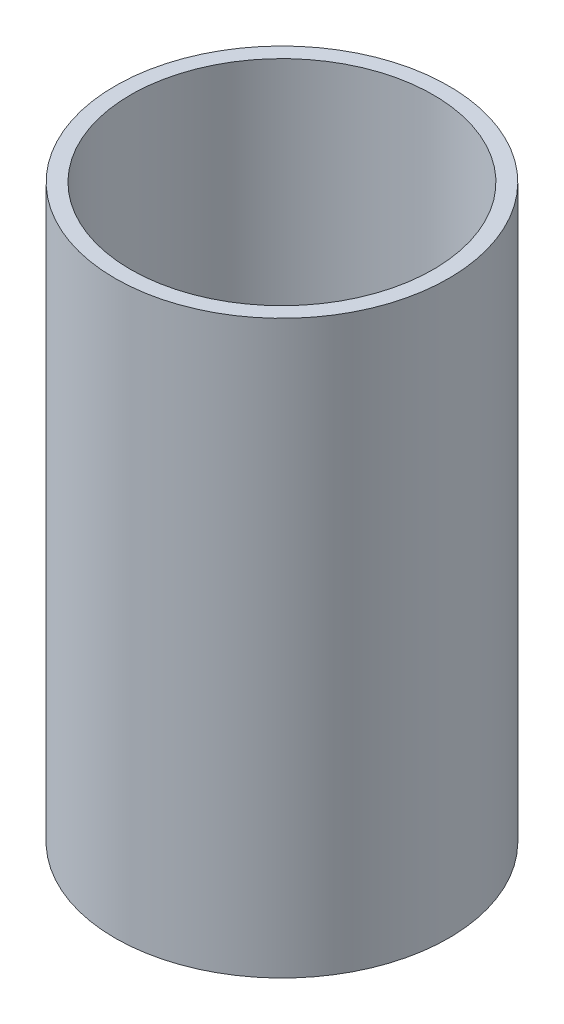
ISO-10303-21;
HEADER;
FILE_DESCRIPTION(('STEP AP214'),'2;1');
FILE_NAME('part.step','',(''),(''),'','','');
FILE_SCHEMA(('AUTOMOTIVE_DESIGN { 1 0 10303 214 1 1 1 1 }'));
ENDSEC;
DATA;
#1=APPLICATION_CONTEXT('core data for automotive mechanical design processes');
#2=APPLICATION_PROTOCOL_DEFINITION('international standard','automotive_design',2000,#1);
#3=PRODUCT_CONTEXT('',#1,'mechanical');
#4=PRODUCT('Part','Part','',(#3));
#5=PRODUCT_RELATED_PRODUCT_CATEGORY('part','',(#4));
#6=PRODUCT_DEFINITION_FORMATION('','',#4);
#7=PRODUCT_DEFINITION_CONTEXT('part definition',#1,'design');
#8=PRODUCT_DEFINITION('design','',#6,#7);
#9=PRODUCT_DEFINITION_SHAPE('','',#8);
#10=(LENGTH_UNIT() NAMED_UNIT(*) SI_UNIT(.MILLI.,.METRE.));
#11=(NAMED_UNIT(*) PLANE_ANGLE_UNIT() SI_UNIT($,.RADIAN.));
#12=(NAMED_UNIT(*) SI_UNIT($,.STERADIAN.) SOLID_ANGLE_UNIT());
#13=UNCERTAINTY_MEASURE_WITH_UNIT(LENGTH_MEASURE(1.E-05),#10,'distance_accuracy_value','');
#14=(GEOMETRIC_REPRESENTATION_CONTEXT(3) GLOBAL_UNCERTAINTY_ASSIGNED_CONTEXT((#13)) GLOBAL_UNIT_ASSIGNED_CONTEXT((#10,
#11,#12)) REPRESENTATION_CONTEXT('',''));
#15=CARTESIAN_POINT('',(0.,0.,0.));
#16=DIRECTION('',(0.,0.,1.));
#17=DIRECTION('',(1.,0.,0.));
#18=AXIS2_PLACEMENT_3D('',#15,#16,#17);
#19=CARTESIAN_POINT('',(0.,5.,0.));
#20=DIRECTION('',(0.,1.,0.));
#21=DIRECTION('',(0.,0.,1.));
#22=AXIS2_PLACEMENT_3D('',#19,#20,#21);
#23=PLANE('',#22);
#24=DIRECTION('',(0.,0.,1.));
#25=VECTOR('',#24,1.);
#26=CARTESIAN_POINT('',(5.34999999999999,5.,0.));
#27=LINE('',#26,#25);
#28=CARTESIAN_POINT('',(5.35,5.,-4.6));
#29=VERTEX_POINT('',#28);
#30=CARTESIAN_POINT('',(5.35,5.,-3.85));
#31=VERTEX_POINT('',#30);
#32=EDGE_CURVE('E242',#29,#31,#27,.T.);
#33=ORIENTED_EDGE('',*,*,#32,.F.);
#34=DIRECTION('',(1.,0.,0.));
#35=VECTOR('',#34,1.);
#36=CARTESIAN_POINT('',(0.,5.,-4.6));
#37=LINE('',#36,#35);
#38=CARTESIAN_POINT('',(-5.35,5.,-4.6));
#39=VERTEX_POINT('',#38);
#40=EDGE_CURVE('E327',#39,#29,#37,.T.);
#41=ORIENTED_EDGE('',*,*,#40,.F.);
#42=DIRECTION('',(0.,0.,1.));
#43=VECTOR('',#42,1.);
#44=CARTESIAN_POINT('',(-5.35,5.,0.));
#45=LINE('',#44,#43);
#46=CARTESIAN_POINT('',(-5.35,5.,-3.85));
#47=VERTEX_POINT('',#46);
#48=EDGE_CURVE('E11',#39,#47,#45,.T.);
#49=ORIENTED_EDGE('',*,*,#48,.T.);
#50=DIRECTION('',(1.,0.,0.));
#51=VECTOR('',#50,1.);
#52=CARTESIAN_POINT('',(0.,5.,-3.85));
#53=LINE('',#52,#51);
#54=EDGE_CURVE('E207',#47,#31,#53,.T.);
#55=ORIENTED_EDGE('',*,*,#54,.T.);
#56=EDGE_LOOP('',(#33,#41,#49,#55));
#57=FACE_BOUND('',#56,.T.);
#58=ADVANCED_FACE('F35',(#57),#23,.T.);
#59=CARTESIAN_POINT('',(0.,5.,-3.85));
#60=DIRECTION('',(0.,0.,-1.));
#61=DIRECTION('',(-1.,0.,0.));
#62=AXIS2_PLACEMENT_3D('',#59,#60,#61);
#63=PLANE('',#62);
#64=DIRECTION('',(1.,0.,0.));
#65=VECTOR('',#64,1.);
#66=CARTESIAN_POINT('',(0.,0.5,-3.85));
#67=LINE('',#66,#65);
#68=CARTESIAN_POINT('',(2.35,0.5,-3.85));
#69=VERTEX_POINT('',#68);
#70=CARTESIAN_POINT('',(6.6,0.5,-3.85));
#71=VERTEX_POINT('',#70);
#72=EDGE_CURVE('E273',#69,#71,#67,.T.);
#73=ORIENTED_EDGE('',*,*,#72,.T.);
#74=DIRECTION('',(0.,-1.,0.));
#75=VECTOR('',#74,1.);
#76=CARTESIAN_POINT('',(6.6,5.,-3.85));
#77=LINE('',#76,#75);
#78=CARTESIAN_POINT('',(6.6,20.,-3.85));
#79=VERTEX_POINT('',#78);
#80=EDGE_CURVE('E343',#79,#71,#77,.T.);
#81=ORIENTED_EDGE('',*,*,#80,.F.);
#82=DIRECTION('',(1.,0.,0.));
#83=VECTOR('',#82,1.);
#84=CARTESIAN_POINT('',(0.,20.,-3.85));
#85=LINE('',#84,#83);
#86=CARTESIAN_POINT('',(5.35,20.,-3.85));
#87=VERTEX_POINT('',#86);
#88=EDGE_CURVE('E224',#87,#79,#85,.T.);
#89=ORIENTED_EDGE('',*,*,#88,.F.);
#90=DIRECTION('',(0.,-1.,0.));
#91=VECTOR('',#90,1.);
#92=CARTESIAN_POINT('',(5.35,20.,-3.85));
#93=LINE('',#92,#91);
#94=EDGE_CURVE('E238',#87,#31,#93,.T.);
#95=ORIENTED_EDGE('',*,*,#94,.T.);
#96=ORIENTED_EDGE('',*,*,#54,.F.);
#97=DIRECTION('',(0.,-1.,0.));
#98=VECTOR('',#97,1.);
#99=CARTESIAN_POINT('',(-5.35,20.,-3.85));
#100=LINE('',#99,#98);
#101=CARTESIAN_POINT('',(-5.35,20.,-3.85));
#102=VERTEX_POINT('',#101);
#103=EDGE_CURVE('E50',#102,#47,#100,.T.);
#104=ORIENTED_EDGE('',*,*,#103,.F.);
#105=DIRECTION('',(1.,0.,0.));
#106=VECTOR('',#105,1.);
#107=CARTESIAN_POINT('',(0.,20.,-3.85));
#108=LINE('',#107,#106);
#109=CARTESIAN_POINT('',(-6.6,20.,-3.85));
#110=VERTEX_POINT('',#109);
#111=EDGE_CURVE('E262',#110,#102,#108,.T.);
#112=ORIENTED_EDGE('',*,*,#111,.F.);
#113=DIRECTION('',(0.,-1.,0.));
#114=VECTOR('',#113,1.);
#115=CARTESIAN_POINT('',(-6.6,5.,-3.85));
#116=LINE('',#115,#114);
#117=CARTESIAN_POINT('',(-6.6,0.5,-3.85));
#118=VERTEX_POINT('',#117);
#119=EDGE_CURVE('E346',#110,#118,#116,.T.);
#120=ORIENTED_EDGE('',*,*,#119,.T.);
#121=DIRECTION('',(1.,0.,0.));
#122=VECTOR('',#121,1.);
#123=CARTESIAN_POINT('',(0.,0.5,-3.85));
#124=LINE('',#123,#122);
#125=CARTESIAN_POINT('',(-2.35,0.5,-3.85));
#126=VERTEX_POINT('',#125);
#127=EDGE_CURVE('E283',#118,#126,#124,.T.);
#128=ORIENTED_EDGE('',*,*,#127,.T.);
#129=DIRECTION('',(0.,-1.,0.));
#130=VECTOR('',#129,1.);
#131=CARTESIAN_POINT('',(-2.35,0.5,-3.85));
#132=LINE('',#131,#130);
#133=CARTESIAN_POINT('',(-2.35,0.,-3.85));
#134=VERTEX_POINT('',#133);
#135=EDGE_CURVE('E293',#126,#134,#132,.T.);
#136=ORIENTED_EDGE('',*,*,#135,.T.);
#137=DIRECTION('',(1.,0.,0.));
#138=VECTOR('',#137,1.);
#139=CARTESIAN_POINT('',(0.,0.,-3.85));
#140=LINE('',#139,#138);
#141=CARTESIAN_POINT('',(2.35,0.,-3.85));
#142=VERTEX_POINT('',#141);
#143=EDGE_CURVE('E326',#134,#142,#140,.T.);
#144=ORIENTED_EDGE('',*,*,#143,.T.);
#145=DIRECTION('',(0.,-1.,0.));
#146=VECTOR('',#145,1.);
#147=CARTESIAN_POINT('',(2.35,0.5,-3.85));
#148=LINE('',#147,#146);
#149=EDGE_CURVE('E280',#69,#142,#148,.T.);
#150=ORIENTED_EDGE('',*,*,#149,.F.);
#151=EDGE_LOOP('',(#73,#81,#89,#95,#96,#104,#112,#120,#128,#136,#144,#150));
#152=FACE_BOUND('',#151,.T.);
#153=ADVANCED_FACE('F410',(#152),#63,.F.);
#154=CARTESIAN_POINT('',(0.,37.,0.));
#155=DIRECTION('',(0.,-1.,0.));
#156=DIRECTION('',(0.,0.,-1.));
#157=AXIS2_PLACEMENT_3D('',#154,#155,#156);
#158=CYLINDRICAL_SURFACE('',#157,9.8);
#159=CARTESIAN_POINT('',(0.,1.,0.));
#160=DIRECTION('',(0.,1.,0.));
#161=DIRECTION('',(0.,0.,1.));
#162=AXIS2_PLACEMENT_3D('',#159,#160,#161);
#163=CIRCLE('',#162,9.8);
#164=CARTESIAN_POINT('',(0.,1.,9.8));
#165=VERTEX_POINT('',#164);
#166=EDGE_CURVE('E43',#165,#165,#163,.T.);
#167=ORIENTED_EDGE('',*,*,#166,.F.);
#168=EDGE_LOOP('',(#167));
#169=FACE_BOUND('',#168,.T.);
#170=CARTESIAN_POINT('',(0.,37.,0.));
#171=DIRECTION('',(0.,1.,0.));
#172=DIRECTION('',(0.,0.,1.));
#173=AXIS2_PLACEMENT_3D('',#170,#171,#172);
#174=CIRCLE('',#173,9.8);
#175=CARTESIAN_POINT('',(0.,37.,9.8));
#176=VERTEX_POINT('',#175);
#177=EDGE_CURVE('E395',#176,#176,#174,.T.);
#178=ORIENTED_EDGE('',*,*,#177,.T.);
#179=EDGE_LOOP('',(#178));
#180=FACE_BOUND('',#179,.T.);
#181=ADVANCED_FACE('F37',(#169,#180),#158,.F.);
#182=CARTESIAN_POINT('',(0.,37.,0.));
#183=DIRECTION('',(0.,-1.,0.));
#184=DIRECTION('',(0.,0.,-1.));
#185=AXIS2_PLACEMENT_3D('',#182,#183,#184);
#186=CYLINDRICAL_SURFACE('',#185,10.8);
#187=CARTESIAN_POINT('',(0.,37.,0.));
#188=DIRECTION('',(0.,1.,0.));
#189=DIRECTION('',(0.,0.,1.));
#190=AXIS2_PLACEMENT_3D('',#187,#188,#189);
#191=CIRCLE('',#190,10.8);
#192=CARTESIAN_POINT('',(0.,37.,10.8));
#193=VERTEX_POINT('',#192);
#194=EDGE_CURVE('E398',#193,#193,#191,.T.);
#195=ORIENTED_EDGE('',*,*,#194,.F.);
#196=EDGE_LOOP('',(#195));
#197=FACE_BOUND('',#196,.T.);
#198=CARTESIAN_POINT('',(0.,0.,0.));
#199=DIRECTION('',(0.,1.,0.));
#200=DIRECTION('',(0.,0.,1.));
#201=AXIS2_PLACEMENT_3D('',#198,#199,#200);
#202=CIRCLE('',#201,10.8);
#203=CARTESIAN_POINT('',(0.,0.,10.8));
#204=VERTEX_POINT('',#203);
#205=EDGE_CURVE('E394',#204,#204,#202,.T.);
#206=ORIENTED_EDGE('',*,*,#205,.T.);
#207=EDGE_LOOP('',(#206));
#208=FACE_BOUND('',#207,.T.);
#209=ADVANCED_FACE('F409',(#197,#208),#186,.T.);
#210=CARTESIAN_POINT('',(0.,37.,0.));
#211=DIRECTION('',(0.,1.,0.));
#212=DIRECTION('',(0.,0.,1.));
#213=AXIS2_PLACEMENT_3D('',#210,#211,#212);
#214=PLANE('',#213);
#215=ORIENTED_EDGE('',*,*,#177,.F.);
#216=EDGE_LOOP('',(#215));
#217=FACE_BOUND('',#216,.T.);
#218=ORIENTED_EDGE('',*,*,#194,.T.);
#219=EDGE_LOOP('',(#218));
#220=FACE_BOUND('',#219,.T.);
#221=ADVANCED_FACE('F413',(#217,#220),#214,.T.);
#222=CARTESIAN_POINT('',(0.,0.,0.));
#223=DIRECTION('',(0.,1.,0.));
#224=DIRECTION('',(0.,0.,1.));
#225=AXIS2_PLACEMENT_3D('',#222,#223,#224);
#226=PLANE('',#225);
#227=ORIENTED_EDGE('',*,*,#143,.F.);
#228=DIRECTION('',(0.,0.,1.));
#229=VECTOR('',#228,1.);
#230=CARTESIAN_POINT('',(-2.35,0.,0.));
#231=LINE('',#230,#229);
#232=CARTESIAN_POINT('',(-2.35,0.,1.25));
#233=VERTEX_POINT('',#232);
#234=EDGE_CURVE('E367',#134,#233,#231,.T.);
#235=ORIENTED_EDGE('',*,*,#234,.T.);
#236=DIRECTION('',(1.,0.,0.));
#237=VECTOR('',#236,1.);
#238=CARTESIAN_POINT('',(0.,0.,1.25));
#239=LINE('',#238,#237);
#240=CARTESIAN_POINT('',(2.35,0.,1.25));
#241=VERTEX_POINT('',#240);
#242=EDGE_CURVE('E386',#233,#241,#239,.T.);
#243=ORIENTED_EDGE('',*,*,#242,.T.);
#244=DIRECTION('',(0.,0.,-1.));
#245=VECTOR('',#244,1.);
#246=CARTESIAN_POINT('',(2.35,0.,0.));
#247=LINE('',#246,#245);
#248=EDGE_CURVE('E364',#241,#142,#247,.T.);
#249=ORIENTED_EDGE('',*,*,#248,.T.);
#250=EDGE_LOOP('',(#227,#235,#243,#249));
#251=FACE_BOUND('',#250,.T.);
#252=ORIENTED_EDGE('',*,*,#205,.F.);
#253=EDGE_LOOP('',(#252));
#254=FACE_BOUND('',#253,.T.);
#255=ADVANCED_FACE('F416',(#251,#254),#226,.F.);
#256=CARTESIAN_POINT('',(2.35,1.,0.));
#257=DIRECTION('',(-1.,0.,0.));
#258=DIRECTION('',(0.,0.,1.));
#259=AXIS2_PLACEMENT_3D('',#256,#257,#258);
#260=PLANE('',#259);
#261=ORIENTED_EDGE('',*,*,#248,.F.);
#262=DIRECTION('',(0.,-1.,0.));
#263=VECTOR('',#262,1.);
#264=CARTESIAN_POINT('',(2.35,1.,1.25));
#265=LINE('',#264,#263);
#266=CARTESIAN_POINT('',(2.35,1.,1.25));
#267=VERTEX_POINT('',#266);
#268=EDGE_CURVE('E392',#267,#241,#265,.T.);
#269=ORIENTED_EDGE('',*,*,#268,.F.);
#270=DIRECTION('',(0.,0.,-1.));
#271=VECTOR('',#270,1.);
#272=CARTESIAN_POINT('',(2.35,1.,0.));
#273=LINE('',#272,#271);
#274=CARTESIAN_POINT('',(2.35,1.,-0.5));
#275=VERTEX_POINT('',#274);
#276=EDGE_CURVE('E371',#267,#275,#273,.T.);
#277=ORIENTED_EDGE('',*,*,#276,.T.);
#278=DIRECTION('',(0.,-1.,0.));
#279=VECTOR('',#278,1.);
#280=CARTESIAN_POINT('',(2.35,2.,-0.5));
#281=LINE('',#280,#279);
#282=CARTESIAN_POINT('',(2.35,2.,-0.5));
#283=VERTEX_POINT('',#282);
#284=EDGE_CURVE('E306',#283,#275,#281,.T.);
#285=ORIENTED_EDGE('',*,*,#284,.F.);
#286=DIRECTION('',(0.,0.,1.));
#287=VECTOR('',#286,1.);
#288=CARTESIAN_POINT('',(2.35,2.,0.));
#289=LINE('',#288,#287);
#290=CARTESIAN_POINT('',(2.35,2.,-1.25));
#291=VERTEX_POINT('',#290);
#292=EDGE_CURVE('E298',#291,#283,#289,.T.);
#293=ORIENTED_EDGE('',*,*,#292,.F.);
#294=DIRECTION('',(0.,-1.,0.));
#295=VECTOR('',#294,1.);
#296=CARTESIAN_POINT('',(2.35,2.,-1.25));
#297=LINE('',#296,#295);
#298=CARTESIAN_POINT('',(2.35,0.5,-1.25));
#299=VERTEX_POINT('',#298);
#300=EDGE_CURVE('E309',#291,#299,#297,.T.);
#301=ORIENTED_EDGE('',*,*,#300,.T.);
#302=DIRECTION('',(0.,0.,-1.));
#303=VECTOR('',#302,1.);
#304=CARTESIAN_POINT('',(2.35,0.5,0.));
#305=LINE('',#304,#303);
#306=EDGE_CURVE('E275',#299,#69,#305,.T.);
#307=ORIENTED_EDGE('',*,*,#306,.T.);
#308=ORIENTED_EDGE('',*,*,#149,.T.);
#309=EDGE_LOOP('',(#261,#269,#277,#285,#293,#301,#307,#308));
#310=FACE_BOUND('',#309,.T.);
#311=ADVANCED_FACE('F425',(#310),#260,.T.);
#312=CARTESIAN_POINT('',(0.,1.,1.25));
#313=DIRECTION('',(0.,0.,-1.));
#314=DIRECTION('',(-1.,0.,0.));
#315=AXIS2_PLACEMENT_3D('',#312,#313,#314);
#316=PLANE('',#315);
#317=ORIENTED_EDGE('',*,*,#242,.F.);
#318=DIRECTION('',(0.,-1.,0.));
#319=VECTOR('',#318,1.);
#320=CARTESIAN_POINT('',(-2.35,1.,1.25));
#321=LINE('',#320,#319);
#322=CARTESIAN_POINT('',(-2.35,1.,1.25));
#323=VERTEX_POINT('',#322);
#324=EDGE_CURVE('E384',#323,#233,#321,.T.);
#325=ORIENTED_EDGE('',*,*,#324,.F.);
#326=DIRECTION('',(1.,0.,0.));
#327=VECTOR('',#326,1.);
#328=CARTESIAN_POINT('',(0.,1.,1.25));
#329=LINE('',#328,#327);
#330=EDGE_CURVE('E374',#323,#267,#329,.T.);
#331=ORIENTED_EDGE('',*,*,#330,.T.);
#332=ORIENTED_EDGE('',*,*,#268,.T.);
#333=EDGE_LOOP('',(#317,#325,#331,#332));
#334=FACE_BOUND('',#333,.T.);
#335=ADVANCED_FACE('F431',(#334),#316,.T.);
#336=CARTESIAN_POINT('',(-2.35,1.,0.));
#337=DIRECTION('',(1.,0.,0.));
#338=DIRECTION('',(0.,0.,-1.));
#339=AXIS2_PLACEMENT_3D('',#336,#337,#338);
#340=PLANE('',#339);
#341=ORIENTED_EDGE('',*,*,#234,.F.);
#342=ORIENTED_EDGE('',*,*,#135,.F.);
#343=DIRECTION('',(0.,0.,-1.));
#344=VECTOR('',#343,1.);
#345=CARTESIAN_POINT('',(-2.35,0.5,0.));
#346=LINE('',#345,#344);
#347=CARTESIAN_POINT('',(-2.35,0.5,-1.25));
#348=VERTEX_POINT('',#347);
#349=EDGE_CURVE('E290',#348,#126,#346,.T.);
#350=ORIENTED_EDGE('',*,*,#349,.F.);
#351=DIRECTION('',(0.,-1.,0.));
#352=VECTOR('',#351,1.);
#353=CARTESIAN_POINT('',(-2.35,2.,-1.25));
#354=LINE('',#353,#352);
#355=CARTESIAN_POINT('',(-2.35,2.,-1.25));
#356=VERTEX_POINT('',#355);
#357=EDGE_CURVE('E57',#356,#348,#354,.T.);
#358=ORIENTED_EDGE('',*,*,#357,.F.);
#359=DIRECTION('',(0.,0.,1.));
#360=VECTOR('',#359,1.);
#361=CARTESIAN_POINT('',(-2.35,2.,0.));
#362=LINE('',#361,#360);
#363=CARTESIAN_POINT('',(-2.35,2.,-0.5));
#364=VERTEX_POINT('',#363);
#365=EDGE_CURVE('E317',#356,#364,#362,.T.);
#366=ORIENTED_EDGE('',*,*,#365,.T.);
#367=DIRECTION('',(0.,-1.,0.));
#368=VECTOR('',#367,1.);
#369=CARTESIAN_POINT('',(-2.35,2.,-0.5));
#370=LINE('',#369,#368);
#371=CARTESIAN_POINT('',(-2.35,1.,-0.5));
#372=VERTEX_POINT('',#371);
#373=EDGE_CURVE('E323',#364,#372,#370,.T.);
#374=ORIENTED_EDGE('',*,*,#373,.T.);
#375=DIRECTION('',(0.,0.,1.));
#376=VECTOR('',#375,1.);
#377=CARTESIAN_POINT('',(-2.35,1.,0.));
#378=LINE('',#377,#376);
#379=EDGE_CURVE('E377',#372,#323,#378,.T.);
#380=ORIENTED_EDGE('',*,*,#379,.T.);
#381=ORIENTED_EDGE('',*,*,#324,.T.);
#382=EDGE_LOOP('',(#341,#342,#350,#358,#366,#374,#380,#381));
#383=FACE_BOUND('',#382,.T.);
#384=ADVANCED_FACE('F489',(#383),#340,.T.);
#385=CARTESIAN_POINT('',(0.,1.,0.));
#386=DIRECTION('',(0.,1.,0.));
#387=DIRECTION('',(0.,0.,1.));
#388=AXIS2_PLACEMENT_3D('',#385,#386,#387);
#389=PLANE('',#388);
#390=DIRECTION('',(1.,0.,0.));
#391=VECTOR('',#390,1.);
#392=CARTESIAN_POINT('',(0.,1.,-4.6));
#393=LINE('',#392,#391);
#394=CARTESIAN_POINT('',(-7.35,1.,-4.6));
#395=VERTEX_POINT('',#394);
#396=CARTESIAN_POINT('',(7.35,1.,-4.6));
#397=VERTEX_POINT('',#396);
#398=EDGE_CURVE('E365',#395,#397,#393,.T.);
#399=ORIENTED_EDGE('',*,*,#398,.T.);
#400=DIRECTION('',(0.,0.,1.));
#401=VECTOR('',#400,1.);
#402=CARTESIAN_POINT('',(7.35,1.,0.));
#403=LINE('',#402,#401);
#404=CARTESIAN_POINT('',(7.35,1.,-0.500000000000001));
#405=VERTEX_POINT('',#404);
#406=EDGE_CURVE('E203',#397,#405,#403,.T.);
#407=ORIENTED_EDGE('',*,*,#406,.T.);
#408=DIRECTION('',(-1.,0.,0.));
#409=VECTOR('',#408,1.);
#410=CARTESIAN_POINT('',(0.,1.,-0.5));
#411=LINE('',#410,#409);
#412=EDGE_CURVE('E369',#405,#275,#411,.T.);
#413=ORIENTED_EDGE('',*,*,#412,.T.);
#414=ORIENTED_EDGE('',*,*,#276,.F.);
#415=ORIENTED_EDGE('',*,*,#330,.F.);
#416=ORIENTED_EDGE('',*,*,#379,.F.);
#417=DIRECTION('',(1.,0.,0.));
#418=VECTOR('',#417,1.);
#419=CARTESIAN_POINT('',(0.,1.,-0.5));
#420=LINE('',#419,#418);
#421=CARTESIAN_POINT('',(-7.35,1.,-0.5));
#422=VERTEX_POINT('',#421);
#423=EDGE_CURVE('E380',#422,#372,#420,.T.);
#424=ORIENTED_EDGE('',*,*,#423,.F.);
#425=DIRECTION('',(0.,0.,1.));
#426=VECTOR('',#425,1.);
#427=CARTESIAN_POINT('',(-7.35,1.,0.));
#428=LINE('',#427,#426);
#429=EDGE_CURVE('E382',#395,#422,#428,.T.);
#430=ORIENTED_EDGE('',*,*,#429,.F.);
#431=EDGE_LOOP('',(#399,#407,#413,#414,#415,#416,#424,#430));
#432=FACE_BOUND('',#431,.T.);
#433=ORIENTED_EDGE('',*,*,#166,.T.);
#434=EDGE_LOOP('',(#433));
#435=FACE_BOUND('',#434,.T.);
#436=ADVANCED_FACE('F405',(#432,#435),#389,.T.);
#437=CARTESIAN_POINT('',(0.,5.,-4.6));
#438=DIRECTION('',(0.,0.,-1.));
#439=DIRECTION('',(-1.,0.,0.));
#440=AXIS2_PLACEMENT_3D('',#437,#438,#439);
#441=PLANE('',#440);
#442=ORIENTED_EDGE('',*,*,#40,.T.);
#443=DIRECTION('',(0.,-1.,0.));
#444=VECTOR('',#443,1.);
#445=CARTESIAN_POINT('',(5.35,20.,-4.6));
#446=LINE('',#445,#444);
#447=CARTESIAN_POINT('',(5.35,20.,-4.6));
#448=VERTEX_POINT('',#447);
#449=EDGE_CURVE('E221',#448,#29,#446,.T.);
#450=ORIENTED_EDGE('',*,*,#449,.F.);
#451=DIRECTION('',(1.,0.,0.));
#452=VECTOR('',#451,1.);
#453=CARTESIAN_POINT('',(0.,20.,-4.6));
#454=LINE('',#453,#452);
#455=CARTESIAN_POINT('',(7.35,20.,-4.6));
#456=VERTEX_POINT('',#455);
#457=EDGE_CURVE('E213',#448,#456,#454,.T.);
#458=ORIENTED_EDGE('',*,*,#457,.T.);
#459=DIRECTION('',(0.,-1.,0.));
#460=VECTOR('',#459,1.);
#461=CARTESIAN_POINT('',(7.35,5.,-4.6));
#462=LINE('',#461,#460);
#463=EDGE_CURVE('E197',#456,#397,#462,.T.);
#464=ORIENTED_EDGE('',*,*,#463,.T.);
#465=ORIENTED_EDGE('',*,*,#398,.F.);
#466=DIRECTION('',(0.,-1.,0.));
#467=VECTOR('',#466,1.);
#468=CARTESIAN_POINT('',(-7.35,5.,-4.6));
#469=LINE('',#468,#467);
#470=CARTESIAN_POINT('',(-7.35,20.,-4.6));
#471=VERTEX_POINT('',#470);
#472=EDGE_CURVE('E361',#471,#395,#469,.T.);
#473=ORIENTED_EDGE('',*,*,#472,.F.);
#474=DIRECTION('',(1.,0.,0.));
#475=VECTOR('',#474,1.);
#476=CARTESIAN_POINT('',(0.,20.,-4.6));
#477=LINE('',#476,#475);
#478=CARTESIAN_POINT('',(-5.35,20.,-4.6));
#479=VERTEX_POINT('',#478);
#480=EDGE_CURVE('E244',#471,#479,#477,.T.);
#481=ORIENTED_EDGE('',*,*,#480,.T.);
#482=DIRECTION('',(0.,-1.,0.));
#483=VECTOR('',#482,1.);
#484=CARTESIAN_POINT('',(-5.35,20.,-4.6));
#485=LINE('',#484,#483);
#486=EDGE_CURVE('E266',#479,#39,#485,.T.);
#487=ORIENTED_EDGE('',*,*,#486,.T.);
#488=EDGE_LOOP('',(#442,#450,#458,#464,#465,#473,#481,#487));
#489=FACE_BOUND('',#488,.T.);
#490=ADVANCED_FACE('F220',(#489),#441,.T.);
#491=CARTESIAN_POINT('',(-7.35,5.,0.));
#492=DIRECTION('',(1.,0.,0.));
#493=DIRECTION('',(0.,0.,-1.));
#494=AXIS2_PLACEMENT_3D('',#491,#492,#493);
#495=PLANE('',#494);
#496=ORIENTED_EDGE('',*,*,#429,.T.);
#497=DIRECTION('',(0.,-1.,0.));
#498=VECTOR('',#497,1.);
#499=CARTESIAN_POINT('',(-7.35,5.,-0.5));
#500=LINE('',#499,#498);
#501=CARTESIAN_POINT('',(-7.35,20.,-0.5));
#502=VERTEX_POINT('',#501);
#503=EDGE_CURVE('E358',#502,#422,#500,.T.);
#504=ORIENTED_EDGE('',*,*,#503,.F.);
#505=DIRECTION('',(0.,0.,1.));
#506=VECTOR('',#505,1.);
#507=CARTESIAN_POINT('',(-7.35,20.,0.));
#508=LINE('',#507,#506);
#509=EDGE_CURVE('E247',#471,#502,#508,.T.);
#510=ORIENTED_EDGE('',*,*,#509,.F.);
#511=ORIENTED_EDGE('',*,*,#472,.T.);
#512=EDGE_LOOP('',(#496,#504,#510,#511));
#513=FACE_BOUND('',#512,.T.);
#514=ADVANCED_FACE('F480',(#513),#495,.F.);
#515=CARTESIAN_POINT('',(0.,5.,-0.5));
#516=DIRECTION('',(0.,0.,-1.));
#517=DIRECTION('',(-1.,0.,0.));
#518=AXIS2_PLACEMENT_3D('',#515,#516,#517);
#519=PLANE('',#518);
#520=DIRECTION('',(1.,0.,0.));
#521=VECTOR('',#520,1.);
#522=CARTESIAN_POINT('',(0.,2.,-0.5));
#523=LINE('',#522,#521);
#524=CARTESIAN_POINT('',(-5.35,2.,-0.5));
#525=VERTEX_POINT('',#524);
#526=EDGE_CURVE('E315',#525,#364,#523,.T.);
#527=ORIENTED_EDGE('',*,*,#526,.F.);
#528=DIRECTION('',(0.,-1.,0.));
#529=VECTOR('',#528,1.);
#530=CARTESIAN_POINT('',(-5.35,5.,-0.5));
#531=LINE('',#530,#529);
#532=CARTESIAN_POINT('',(-5.35,20.,-0.5));
#533=VERTEX_POINT('',#532);
#534=EDGE_CURVE('E355',#533,#525,#531,.T.);
#535=ORIENTED_EDGE('',*,*,#534,.F.);
#536=DIRECTION('',(1.,0.,0.));
#537=VECTOR('',#536,1.);
#538=CARTESIAN_POINT('',(0.,20.,-0.5));
#539=LINE('',#538,#537);
#540=EDGE_CURVE('E250',#502,#533,#539,.T.);
#541=ORIENTED_EDGE('',*,*,#540,.F.);
#542=ORIENTED_EDGE('',*,*,#503,.T.);
#543=ORIENTED_EDGE('',*,*,#423,.T.);
#544=ORIENTED_EDGE('',*,*,#373,.F.);
#545=EDGE_LOOP('',(#527,#535,#541,#542,#543,#544));
#546=FACE_BOUND('',#545,.T.);
#547=ADVANCED_FACE('F476',(#546),#519,.F.);
#548=CARTESIAN_POINT('',(-5.35,5.,0.));
#549=DIRECTION('',(1.,0.,0.));
#550=DIRECTION('',(0.,0.,-1.));
#551=AXIS2_PLACEMENT_3D('',#548,#549,#550);
#552=PLANE('',#551);
#553=DIRECTION('',(0.,0.,1.));
#554=VECTOR('',#553,1.);
#555=CARTESIAN_POINT('',(-5.35,2.,0.));
#556=LINE('',#555,#554);
#557=CARTESIAN_POINT('',(-5.35,2.,-1.25));
#558=VERTEX_POINT('',#557);
#559=EDGE_CURVE('E312',#558,#525,#556,.T.);
#560=ORIENTED_EDGE('',*,*,#559,.F.);
#561=DIRECTION('',(0.,-1.,0.));
#562=VECTOR('',#561,1.);
#563=CARTESIAN_POINT('',(-5.35,5.,-1.25));
#564=LINE('',#563,#562);
#565=CARTESIAN_POINT('',(-5.35,20.,-1.25));
#566=VERTEX_POINT('',#565);
#567=EDGE_CURVE('E352',#566,#558,#564,.T.);
#568=ORIENTED_EDGE('',*,*,#567,.F.);
#569=DIRECTION('',(0.,0.,1.));
#570=VECTOR('',#569,1.);
#571=CARTESIAN_POINT('',(-5.35,20.,0.));
#572=LINE('',#571,#570);
#573=EDGE_CURVE('E253',#566,#533,#572,.T.);
#574=ORIENTED_EDGE('',*,*,#573,.T.);
#575=ORIENTED_EDGE('',*,*,#534,.T.);
#576=EDGE_LOOP('',(#560,#568,#574,#575));
#577=FACE_BOUND('',#576,.T.);
#578=ADVANCED_FACE('F473',(#577),#552,.T.);
#579=CARTESIAN_POINT('',(0.,5.,-1.25));
#580=DIRECTION('',(0.,0.,1.));
#581=DIRECTION('',(1.,0.,0.));
#582=AXIS2_PLACEMENT_3D('',#579,#580,#581);
#583=PLANE('',#582);
#584=DIRECTION('',(-1.,0.,0.));
#585=VECTOR('',#584,1.);
#586=CARTESIAN_POINT('',(0.,0.5,-1.25));
#587=LINE('',#586,#585);
#588=CARTESIAN_POINT('',(-6.6,0.5,-1.25));
#589=VERTEX_POINT('',#588);
#590=EDGE_CURVE('E288',#348,#589,#587,.T.);
#591=ORIENTED_EDGE('',*,*,#590,.T.);
#592=DIRECTION('',(0.,-1.,0.));
#593=VECTOR('',#592,1.);
#594=CARTESIAN_POINT('',(-6.6,5.,-1.25));
#595=LINE('',#594,#593);
#596=CARTESIAN_POINT('',(-6.6,20.,-1.25));
#597=VERTEX_POINT('',#596);
#598=EDGE_CURVE('E349',#597,#589,#595,.T.);
#599=ORIENTED_EDGE('',*,*,#598,.F.);
#600=DIRECTION('',(-1.,0.,0.));
#601=VECTOR('',#600,1.);
#602=CARTESIAN_POINT('',(0.,20.,-1.25));
#603=LINE('',#602,#601);
#604=EDGE_CURVE('E256',#566,#597,#603,.T.);
#605=ORIENTED_EDGE('',*,*,#604,.F.);
#606=ORIENTED_EDGE('',*,*,#567,.T.);
#607=DIRECTION('',(-1.,0.,0.));
#608=VECTOR('',#607,1.);
#609=CARTESIAN_POINT('',(0.,2.,-1.25));
#610=LINE('',#609,#608);
#611=EDGE_CURVE('E320',#356,#558,#610,.T.);
#612=ORIENTED_EDGE('',*,*,#611,.F.);
#613=ORIENTED_EDGE('',*,*,#357,.T.);
#614=EDGE_LOOP('',(#591,#599,#605,#606,#612,#613));
#615=FACE_BOUND('',#614,.T.);
#616=ADVANCED_FACE('F469',(#615),#583,.F.);
#617=CARTESIAN_POINT('',(-6.6,5.,0.));
#618=DIRECTION('',(1.,0.,0.));
#619=DIRECTION('',(0.,0.,-1.));
#620=AXIS2_PLACEMENT_3D('',#617,#618,#619);
#621=PLANE('',#620);
#622=DIRECTION('',(0.,0.,1.));
#623=VECTOR('',#622,1.);
#624=CARTESIAN_POINT('',(-6.6,0.5,0.));
#625=LINE('',#624,#623);
#626=EDGE_CURVE('E285',#118,#589,#625,.T.);
#627=ORIENTED_EDGE('',*,*,#626,.F.);
#628=ORIENTED_EDGE('',*,*,#119,.F.);
#629=DIRECTION('',(0.,0.,1.));
#630=VECTOR('',#629,1.);
#631=CARTESIAN_POINT('',(-6.6,20.,0.));
#632=LINE('',#631,#630);
#633=EDGE_CURVE('E259',#110,#597,#632,.T.);
#634=ORIENTED_EDGE('',*,*,#633,.T.);
#635=ORIENTED_EDGE('',*,*,#598,.T.);
#636=EDGE_LOOP('',(#627,#628,#634,#635));
#637=FACE_BOUND('',#636,.T.);
#638=ADVANCED_FACE('F464',(#637),#621,.T.);
#639=CARTESIAN_POINT('',(6.6,5.,0.));
#640=DIRECTION('',(1.,0.,0.));
#641=DIRECTION('',(0.,0.,-1.));
#642=AXIS2_PLACEMENT_3D('',#639,#640,#641);
#643=PLANE('',#642);
#644=ORIENTED_EDGE('',*,*,#80,.T.);
#645=DIRECTION('',(0.,0.,1.));
#646=VECTOR('',#645,1.);
#647=CARTESIAN_POINT('',(6.6,0.5,0.));
#648=LINE('',#647,#646);
#649=CARTESIAN_POINT('',(6.6,0.5,-1.25));
#650=VERTEX_POINT('',#649);
#651=EDGE_CURVE('E270',#71,#650,#648,.T.);
#652=ORIENTED_EDGE('',*,*,#651,.T.);
#653=DIRECTION('',(0.,-1.,0.));
#654=VECTOR('',#653,1.);
#655=CARTESIAN_POINT('',(6.6,5.,-1.25));
#656=LINE('',#655,#654);
#657=CARTESIAN_POINT('',(6.6,20.,-1.25));
#658=VERTEX_POINT('',#657);
#659=EDGE_CURVE('E340',#658,#650,#656,.T.);
#660=ORIENTED_EDGE('',*,*,#659,.F.);
#661=DIRECTION('',(0.,0.,1.));
#662=VECTOR('',#661,1.);
#663=CARTESIAN_POINT('',(6.6,20.,0.));
#664=LINE('',#663,#662);
#665=EDGE_CURVE('E229',#79,#658,#664,.T.);
#666=ORIENTED_EDGE('',*,*,#665,.F.);
#667=EDGE_LOOP('',(#644,#652,#660,#666));
#668=FACE_BOUND('',#667,.T.);
#669=ADVANCED_FACE('F461',(#668),#643,.F.);
#670=CARTESIAN_POINT('',(0.,5.,-1.25));
#671=DIRECTION('',(0.,0.,-1.));
#672=DIRECTION('',(-1.,0.,0.));
#673=AXIS2_PLACEMENT_3D('',#670,#671,#672);
#674=PLANE('',#673);
#675=ORIENTED_EDGE('',*,*,#659,.T.);
#676=DIRECTION('',(1.,0.,0.));
#677=VECTOR('',#676,1.);
#678=CARTESIAN_POINT('',(0.,0.5,-1.25));
#679=LINE('',#678,#677);
#680=EDGE_CURVE('E278',#299,#650,#679,.T.);
#681=ORIENTED_EDGE('',*,*,#680,.F.);
#682=ORIENTED_EDGE('',*,*,#300,.F.);
#683=DIRECTION('',(1.,0.,0.));
#684=VECTOR('',#683,1.);
#685=CARTESIAN_POINT('',(0.,2.,-1.25));
#686=LINE('',#685,#684);
#687=CARTESIAN_POINT('',(5.35,2.,-1.25));
#688=VERTEX_POINT('',#687);
#689=EDGE_CURVE('E296',#291,#688,#686,.T.);
#690=ORIENTED_EDGE('',*,*,#689,.T.);
#691=DIRECTION('',(0.,-1.,0.));
#692=VECTOR('',#691,1.);
#693=CARTESIAN_POINT('',(5.35,5.,-1.25));
#694=LINE('',#693,#692);
#695=CARTESIAN_POINT('',(5.35,20.,-1.25));
#696=VERTEX_POINT('',#695);
#697=EDGE_CURVE('E337',#696,#688,#694,.T.);
#698=ORIENTED_EDGE('',*,*,#697,.F.);
#699=DIRECTION('',(1.,0.,0.));
#700=VECTOR('',#699,1.);
#701=CARTESIAN_POINT('',(0.,20.,-1.25));
#702=LINE('',#701,#700);
#703=EDGE_CURVE('E232',#696,#658,#702,.T.);
#704=ORIENTED_EDGE('',*,*,#703,.T.);
#705=EDGE_LOOP('',(#675,#681,#682,#690,#698,#704));
#706=FACE_BOUND('',#705,.T.);
#707=ADVANCED_FACE('F457',(#706),#674,.T.);
#708=CARTESIAN_POINT('',(5.35,5.,0.));
#709=DIRECTION('',(1.,0.,0.));
#710=DIRECTION('',(0.,0.,-1.));
#711=AXIS2_PLACEMENT_3D('',#708,#709,#710);
#712=PLANE('',#711);
#713=ORIENTED_EDGE('',*,*,#697,.T.);
#714=DIRECTION('',(0.,0.,1.));
#715=VECTOR('',#714,1.);
#716=CARTESIAN_POINT('',(5.35,2.,0.));
#717=LINE('',#716,#715);
#718=CARTESIAN_POINT('',(5.35,2.,-0.5));
#719=VERTEX_POINT('',#718);
#720=EDGE_CURVE('E303',#688,#719,#717,.T.);
#721=ORIENTED_EDGE('',*,*,#720,.T.);
#722=DIRECTION('',(0.,-1.,0.));
#723=VECTOR('',#722,1.);
#724=CARTESIAN_POINT('',(5.35,5.,-0.5));
#725=LINE('',#724,#723);
#726=CARTESIAN_POINT('',(5.35,20.,-0.5));
#727=VERTEX_POINT('',#726);
#728=EDGE_CURVE('E334',#727,#719,#725,.T.);
#729=ORIENTED_EDGE('',*,*,#728,.F.);
#730=DIRECTION('',(0.,0.,1.));
#731=VECTOR('',#730,1.);
#732=CARTESIAN_POINT('',(5.35,20.,0.));
#733=LINE('',#732,#731);
#734=EDGE_CURVE('E235',#696,#727,#733,.T.);
#735=ORIENTED_EDGE('',*,*,#734,.F.);
#736=EDGE_LOOP('',(#713,#721,#729,#735));
#737=FACE_BOUND('',#736,.T.);
#738=ADVANCED_FACE('F453',(#737),#712,.F.);
#739=CARTESIAN_POINT('',(0.,5.,-0.5));
#740=DIRECTION('',(0.,0.,1.));
#741=DIRECTION('',(1.,0.,0.));
#742=AXIS2_PLACEMENT_3D('',#739,#740,#741);
#743=PLANE('',#742);
#744=ORIENTED_EDGE('',*,*,#728,.T.);
#745=DIRECTION('',(-1.,0.,0.));
#746=VECTOR('',#745,1.);
#747=CARTESIAN_POINT('',(0.,2.,-0.5));
#748=LINE('',#747,#746);
#749=EDGE_CURVE('E300',#719,#283,#748,.T.);
#750=ORIENTED_EDGE('',*,*,#749,.T.);
#751=ORIENTED_EDGE('',*,*,#284,.T.);
#752=ORIENTED_EDGE('',*,*,#412,.F.);
#753=DIRECTION('',(0.,-1.,0.));
#754=VECTOR('',#753,1.);
#755=CARTESIAN_POINT('',(7.35,5.,-0.500000000000001));
#756=LINE('',#755,#754);
#757=CARTESIAN_POINT('',(7.35,20.,-0.500000000000001));
#758=VERTEX_POINT('',#757);
#759=EDGE_CURVE('E206',#758,#405,#756,.T.);
#760=ORIENTED_EDGE('',*,*,#759,.F.);
#761=DIRECTION('',(-1.,0.,0.));
#762=VECTOR('',#761,1.);
#763=CARTESIAN_POINT('',(0.,20.,-0.5));
#764=LINE('',#763,#762);
#765=EDGE_CURVE('E217',#758,#727,#764,.T.);
#766=ORIENTED_EDGE('',*,*,#765,.T.);
#767=EDGE_LOOP('',(#744,#750,#751,#752,#760,#766));
#768=FACE_BOUND('',#767,.T.);
#769=ADVANCED_FACE('F450',(#768),#743,.T.);
#770=CARTESIAN_POINT('',(7.35,5.,0.));
#771=DIRECTION('',(1.,0.,0.));
#772=DIRECTION('',(0.,0.,-1.));
#773=AXIS2_PLACEMENT_3D('',#770,#771,#772);
#774=PLANE('',#773);
#775=ORIENTED_EDGE('',*,*,#759,.T.);
#776=ORIENTED_EDGE('',*,*,#406,.F.);
#777=ORIENTED_EDGE('',*,*,#463,.F.);
#778=DIRECTION('',(0.,0.,1.));
#779=VECTOR('',#778,1.);
#780=CARTESIAN_POINT('',(7.35,20.,0.));
#781=LINE('',#780,#779);
#782=EDGE_CURVE('E200',#456,#758,#781,.T.);
#783=ORIENTED_EDGE('',*,*,#782,.T.);
#784=EDGE_LOOP('',(#775,#776,#777,#783));
#785=FACE_BOUND('',#784,.T.);
#786=ADVANCED_FACE('F199',(#785),#774,.T.);
#787=CARTESIAN_POINT('',(0.,2.,0.));
#788=DIRECTION('',(0.,1.,0.));
#789=DIRECTION('',(0.,0.,1.));
#790=AXIS2_PLACEMENT_3D('',#787,#788,#789);
#791=PLANE('',#790);
#792=ORIENTED_EDGE('',*,*,#559,.T.);
#793=ORIENTED_EDGE('',*,*,#526,.T.);
#794=ORIENTED_EDGE('',*,*,#365,.F.);
#795=ORIENTED_EDGE('',*,*,#611,.T.);
#796=EDGE_LOOP('',(#792,#793,#794,#795));
#797=FACE_BOUND('',#796,.T.);
#798=ADVANCED_FACE('F446',(#797),#791,.T.);
#799=CARTESIAN_POINT('',(0.,2.,0.));
#800=DIRECTION('',(0.,1.,0.));
#801=DIRECTION('',(0.,0.,1.));
#802=AXIS2_PLACEMENT_3D('',#799,#800,#801);
#803=PLANE('',#802);
#804=ORIENTED_EDGE('',*,*,#689,.F.);
#805=ORIENTED_EDGE('',*,*,#292,.T.);
#806=ORIENTED_EDGE('',*,*,#749,.F.);
#807=ORIENTED_EDGE('',*,*,#720,.F.);
#808=EDGE_LOOP('',(#804,#805,#806,#807));
#809=FACE_BOUND('',#808,.T.);
#810=ADVANCED_FACE('F540',(#809),#803,.T.);
#811=CARTESIAN_POINT('',(0.,0.5,0.));
#812=DIRECTION('',(0.,1.,0.));
#813=DIRECTION('',(0.,0.,1.));
#814=AXIS2_PLACEMENT_3D('',#811,#812,#813);
#815=PLANE('',#814);
#816=ORIENTED_EDGE('',*,*,#127,.F.);
#817=ORIENTED_EDGE('',*,*,#626,.T.);
#818=ORIENTED_EDGE('',*,*,#590,.F.);
#819=ORIENTED_EDGE('',*,*,#349,.T.);
#820=EDGE_LOOP('',(#816,#817,#818,#819));
#821=FACE_BOUND('',#820,.T.);
#822=ADVANCED_FACE('F515',(#821),#815,.T.);
#823=CARTESIAN_POINT('',(0.,0.5,0.));
#824=DIRECTION('',(0.,1.,0.));
#825=DIRECTION('',(0.,0.,1.));
#826=AXIS2_PLACEMENT_3D('',#823,#824,#825);
#827=PLANE('',#826);
#828=ORIENTED_EDGE('',*,*,#651,.F.);
#829=ORIENTED_EDGE('',*,*,#72,.F.);
#830=ORIENTED_EDGE('',*,*,#306,.F.);
#831=ORIENTED_EDGE('',*,*,#680,.T.);
#832=EDGE_LOOP('',(#828,#829,#830,#831));
#833=FACE_BOUND('',#832,.T.);
#834=ADVANCED_FACE('F546',(#833),#827,.T.);
#835=CARTESIAN_POINT('',(-5.35,20.,0.));
#836=DIRECTION('',(-1.,0.,0.));
#837=DIRECTION('',(0.,0.,1.));
#838=AXIS2_PLACEMENT_3D('',#835,#836,#837);
#839=PLANE('',#838);
#840=ORIENTED_EDGE('',*,*,#48,.F.);
#841=ORIENTED_EDGE('',*,*,#486,.F.);
#842=DIRECTION('',(0.,0.,-1.));
#843=VECTOR('',#842,1.);
#844=CARTESIAN_POINT('',(-5.35,20.,0.));
#845=LINE('',#844,#843);
#846=EDGE_CURVE('E264',#102,#479,#845,.T.);
#847=ORIENTED_EDGE('',*,*,#846,.F.);
#848=ORIENTED_EDGE('',*,*,#103,.T.);
#849=EDGE_LOOP('',(#840,#841,#847,#848));
#850=FACE_BOUND('',#849,.T.);
#851=ADVANCED_FACE('F551',(#850),#839,.F.);
#852=CARTESIAN_POINT('',(0.,20.,0.));
#853=DIRECTION('',(0.,1.,0.));
#854=DIRECTION('',(0.,0.,1.));
#855=AXIS2_PLACEMENT_3D('',#852,#853,#854);
#856=PLANE('',#855);
#857=ORIENTED_EDGE('',*,*,#480,.F.);
#858=ORIENTED_EDGE('',*,*,#509,.T.);
#859=ORIENTED_EDGE('',*,*,#540,.T.);
#860=ORIENTED_EDGE('',*,*,#573,.F.);
#861=ORIENTED_EDGE('',*,*,#604,.T.);
#862=ORIENTED_EDGE('',*,*,#633,.F.);
#863=ORIENTED_EDGE('',*,*,#111,.T.);
#864=ORIENTED_EDGE('',*,*,#846,.T.);
#865=EDGE_LOOP('',(#857,#858,#859,#860,#861,#862,#863,#864));
#866=FACE_BOUND('',#865,.T.);
#867=ADVANCED_FACE('F524',(#866),#856,.T.);
#868=CARTESIAN_POINT('',(5.34999999999999,20.,0.));
#869=DIRECTION('',(-1.,0.,0.));
#870=DIRECTION('',(0.,0.,1.));
#871=AXIS2_PLACEMENT_3D('',#868,#869,#870);
#872=PLANE('',#871);
#873=ORIENTED_EDGE('',*,*,#449,.T.);
#874=ORIENTED_EDGE('',*,*,#32,.T.);
#875=ORIENTED_EDGE('',*,*,#94,.F.);
#876=DIRECTION('',(0.,0.,-1.));
#877=VECTOR('',#876,1.);
#878=CARTESIAN_POINT('',(5.34999999999999,20.,0.));
#879=LINE('',#878,#877);
#880=EDGE_CURVE('E222',#87,#448,#879,.T.);
#881=ORIENTED_EDGE('',*,*,#880,.T.);
#882=EDGE_LOOP('',(#873,#874,#875,#881));
#883=FACE_BOUND('',#882,.T.);
#884=ADVANCED_FACE('F530',(#883),#872,.T.);
#885=CARTESIAN_POINT('',(0.,20.,0.));
#886=DIRECTION('',(0.,1.,0.));
#887=DIRECTION('',(0.,0.,1.));
#888=AXIS2_PLACEMENT_3D('',#885,#886,#887);
#889=PLANE('',#888);
#890=ORIENTED_EDGE('',*,*,#782,.F.);
#891=ORIENTED_EDGE('',*,*,#457,.F.);
#892=ORIENTED_EDGE('',*,*,#880,.F.);
#893=ORIENTED_EDGE('',*,*,#88,.T.);
#894=ORIENTED_EDGE('',*,*,#665,.T.);
#895=ORIENTED_EDGE('',*,*,#703,.F.);
#896=ORIENTED_EDGE('',*,*,#734,.T.);
#897=ORIENTED_EDGE('',*,*,#765,.F.);
#898=EDGE_LOOP('',(#890,#891,#892,#893,#894,#895,#896,#897));
#899=FACE_BOUND('',#898,.T.);
#900=ADVANCED_FACE('F211',(#899),#889,.T.);
#901=CLOSED_SHELL('',(#58,#153,#181,#209,#221,#255,#311,#335,#384,#436,#490,#514,#547,#578,#616,
#638,#669,#707,#738,#769,#786,#798,#810,#822,#834,#851,#867,#884,#900));
#902=MANIFOLD_SOLID_BREP('B2',#901);
#903=ADVANCED_BREP_SHAPE_REPRESENTATION('',(#18,#902),#14);
#904=SHAPE_DEFINITION_REPRESENTATION(#9,#903);
ENDSEC;
END-ISO-10303-21;
